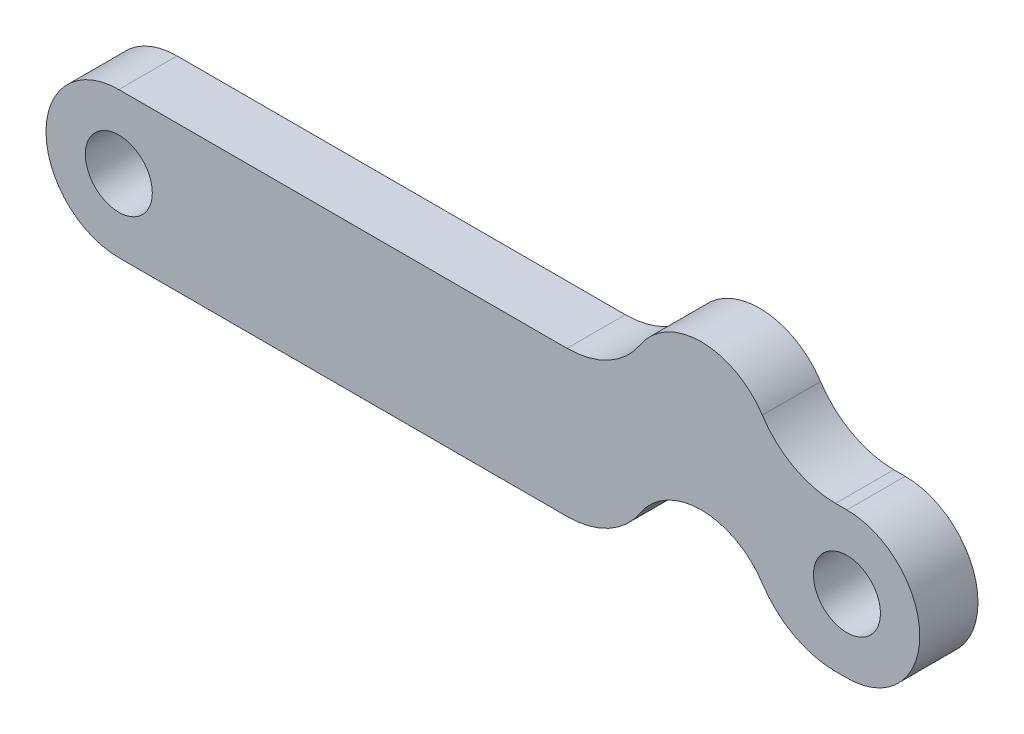
ISO-10303-21;
HEADER;
FILE_DESCRIPTION(('STEP AP214'),'2;1');
FILE_NAME('part.step','',(''),(''),'','','');
FILE_SCHEMA(('AUTOMOTIVE_DESIGN { 1 0 10303 214 1 1 1 1 }'));
ENDSEC;
DATA;
#1=APPLICATION_CONTEXT('core data for automotive mechanical design processes');
#2=APPLICATION_PROTOCOL_DEFINITION('international standard','automotive_design',2000,#1);
#3=PRODUCT_CONTEXT('',#1,'mechanical');
#4=PRODUCT('Part','Part','',(#3));
#5=PRODUCT_RELATED_PRODUCT_CATEGORY('part','',(#4));
#6=PRODUCT_DEFINITION_FORMATION('','',#4);
#7=PRODUCT_DEFINITION_CONTEXT('part definition',#1,'design');
#8=PRODUCT_DEFINITION('design','',#6,#7);
#9=PRODUCT_DEFINITION_SHAPE('','',#8);
#10=(LENGTH_UNIT() NAMED_UNIT(*) SI_UNIT(.MILLI.,.METRE.));
#11=(NAMED_UNIT(*) PLANE_ANGLE_UNIT() SI_UNIT($,.RADIAN.));
#12=(NAMED_UNIT(*) SI_UNIT($,.STERADIAN.) SOLID_ANGLE_UNIT());
#13=UNCERTAINTY_MEASURE_WITH_UNIT(LENGTH_MEASURE(1.E-05),#10,'distance_accuracy_value','');
#14=(GEOMETRIC_REPRESENTATION_CONTEXT(3) GLOBAL_UNCERTAINTY_ASSIGNED_CONTEXT((#13)) GLOBAL_UNIT_ASSIGNED_CONTEXT((#10,
#11,#12)) REPRESENTATION_CONTEXT('',''));
#15=CARTESIAN_POINT('',(0.,0.,0.));
#16=DIRECTION('',(0.,0.,1.));
#17=DIRECTION('',(1.,0.,0.));
#18=AXIS2_PLACEMENT_3D('',#15,#16,#17);
#19=CARTESIAN_POINT('',(24.6097722286465,0.5,2.));
#20=DIRECTION('',(0.,0.,-1.));
#21=DIRECTION('',(-1.,0.,0.));
#22=AXIS2_PLACEMENT_3D('',#19,#20,#21);
#23=CYLINDRICAL_SURFACE('',#22,3.);
#24=CARTESIAN_POINT('',(24.6097722286465,0.5,2.));
#25=DIRECTION('',(0.,0.,1.));
#26=DIRECTION('',(1.,0.,0.));
#27=AXIS2_PLACEMENT_3D('',#24,#25,#26);
#28=CIRCLE('',#27,3.);
#29=CARTESIAN_POINT('',(22.0953510130211,-1.13636363636364,2.));
#30=VERTEX_POINT('',#29);
#31=CARTESIAN_POINT('',(24.6097722286465,-2.5,2.));
#32=VERTEX_POINT('',#31);
#33=EDGE_CURVE('E163',#30,#32,#28,.T.);
#34=ORIENTED_EDGE('',*,*,#33,.F.);
#35=DIRECTION('',(0.,0.,1.));
#36=VECTOR('',#35,1.);
#37=CARTESIAN_POINT('',(22.0953510130211,-1.13636363636364,2.));
#38=LINE('',#37,#36);
#39=CARTESIAN_POINT('',(22.0953510130211,-1.13636363636364,0.));
#40=VERTEX_POINT('',#39);
#41=EDGE_CURVE('E681',#40,#30,#38,.T.);
#42=ORIENTED_EDGE('',*,*,#41,.F.);
#43=CARTESIAN_POINT('',(24.6097722286465,0.5,0.));
#44=DIRECTION('',(0.,0.,-1.));
#45=DIRECTION('',(1.,0.,0.));
#46=AXIS2_PLACEMENT_3D('',#43,#44,#45);
#47=CIRCLE('',#46,3.);
#48=CARTESIAN_POINT('',(24.6097722286465,-2.5,0.));
#49=VERTEX_POINT('',#48);
#50=EDGE_CURVE('E11',#49,#40,#47,.T.);
#51=ORIENTED_EDGE('',*,*,#50,.F.);
#52=DIRECTION('',(0.,0.,-1.));
#53=VECTOR('',#52,1.);
#54=CARTESIAN_POINT('',(24.6097722286465,-2.5,0.));
#55=LINE('',#54,#53);
#56=EDGE_CURVE('E698',#32,#49,#55,.T.);
#57=ORIENTED_EDGE('',*,*,#56,.F.);
#58=EDGE_LOOP('',(#34,#42,#51,#57));
#59=FACE_BOUND('',#58,.T.);
#60=ADVANCED_FACE('F17',(#59),#23,.T.);
#61=CARTESIAN_POINT('',(15.3902277713535,0.5,2.));
#62=DIRECTION('',(0.,0.,-1.));
#63=DIRECTION('',(-1.,0.,0.));
#64=AXIS2_PLACEMENT_3D('',#61,#62,#63);
#65=CYLINDRICAL_SURFACE('',#64,3.);
#66=CARTESIAN_POINT('',(15.3902277713535,0.5,2.));
#67=DIRECTION('',(0.,0.,1.));
#68=DIRECTION('',(1.,0.,0.));
#69=AXIS2_PLACEMENT_3D('',#66,#67,#68);
#70=CIRCLE('',#69,3.);
#71=CARTESIAN_POINT('',(15.3902277713535,-2.5,2.));
#72=VERTEX_POINT('',#71);
#73=CARTESIAN_POINT('',(17.9046489869789,-1.13636363636364,2.));
#74=VERTEX_POINT('',#73);
#75=EDGE_CURVE('E39',#72,#74,#70,.T.);
#76=ORIENTED_EDGE('',*,*,#75,.F.);
#77=DIRECTION('',(0.,0.,1.));
#78=VECTOR('',#77,1.);
#79=CARTESIAN_POINT('',(15.3902277713535,-2.5,2.));
#80=LINE('',#79,#78);
#81=CARTESIAN_POINT('',(15.3902277713535,-2.5,0.));
#82=VERTEX_POINT('',#81);
#83=EDGE_CURVE('E154',#82,#72,#80,.T.);
#84=ORIENTED_EDGE('',*,*,#83,.F.);
#85=CARTESIAN_POINT('',(15.3902277713535,0.5,0.));
#86=DIRECTION('',(0.,0.,-1.));
#87=DIRECTION('',(1.,0.,0.));
#88=AXIS2_PLACEMENT_3D('',#85,#86,#87);
#89=CIRCLE('',#88,3.);
#90=CARTESIAN_POINT('',(17.9046489869789,-1.13636363636364,0.));
#91=VERTEX_POINT('',#90);
#92=EDGE_CURVE('E52',#91,#82,#89,.T.);
#93=ORIENTED_EDGE('',*,*,#92,.F.);
#94=DIRECTION('',(0.,0.,-1.));
#95=VECTOR('',#94,1.);
#96=CARTESIAN_POINT('',(17.9046489869789,-1.13636363636364,2.));
#97=LINE('',#96,#95);
#98=EDGE_CURVE('E665',#74,#91,#97,.T.);
#99=ORIENTED_EDGE('',*,*,#98,.F.);
#100=EDGE_LOOP('',(#76,#84,#93,#99));
#101=FACE_BOUND('',#100,.T.);
#102=ADVANCED_FACE('F444',(#101),#65,.T.);
#103=CARTESIAN_POINT('',(24.6097722286465,5.5,2.));
#104=DIRECTION('',(0.,0.,-1.));
#105=DIRECTION('',(-1.,0.,0.));
#106=AXIS2_PLACEMENT_3D('',#103,#104,#105);
#107=CYLINDRICAL_SURFACE('',#106,3.);
#108=CARTESIAN_POINT('',(24.6097722286465,5.5,2.));
#109=DIRECTION('',(0.,0.,-1.));
#110=DIRECTION('',(1.,0.,0.));
#111=AXIS2_PLACEMENT_3D('',#108,#109,#110);
#112=CIRCLE('',#111,3.);
#113=CARTESIAN_POINT('',(24.6097722286465,2.5,2.));
#114=VERTEX_POINT('',#113);
#115=CARTESIAN_POINT('',(22.0953510130211,3.86363636363636,2.));
#116=VERTEX_POINT('',#115);
#117=EDGE_CURVE('E170',#114,#116,#112,.T.);
#118=ORIENTED_EDGE('',*,*,#117,.F.);
#119=DIRECTION('',(0.,0.,1.));
#120=VECTOR('',#119,1.);
#121=CARTESIAN_POINT('',(24.6097722286465,2.5,2.));
#122=LINE('',#121,#120);
#123=CARTESIAN_POINT('',(24.6097722286465,2.5,0.));
#124=VERTEX_POINT('',#123);
#125=EDGE_CURVE('E249',#124,#114,#122,.T.);
#126=ORIENTED_EDGE('',*,*,#125,.F.);
#127=CARTESIAN_POINT('',(24.6097722286465,5.5,0.));
#128=DIRECTION('',(0.,0.,1.));
#129=DIRECTION('',(1.,0.,0.));
#130=AXIS2_PLACEMENT_3D('',#127,#128,#129);
#131=CIRCLE('',#130,3.);
#132=CARTESIAN_POINT('',(22.0953510130211,3.86363636363636,0.));
#133=VERTEX_POINT('',#132);
#134=EDGE_CURVE('E20',#133,#124,#131,.T.);
#135=ORIENTED_EDGE('',*,*,#134,.F.);
#136=DIRECTION('',(0.,0.,-1.));
#137=VECTOR('',#136,1.);
#138=CARTESIAN_POINT('',(22.0953510130211,3.86363636363636,2.));
#139=LINE('',#138,#137);
#140=EDGE_CURVE('E146',#116,#133,#139,.T.);
#141=ORIENTED_EDGE('',*,*,#140,.F.);
#142=EDGE_LOOP('',(#118,#126,#135,#141));
#143=FACE_BOUND('',#142,.T.);
#144=ADVANCED_FACE('F395',(#143),#107,.F.);
#145=CARTESIAN_POINT('',(15.3902277713535,5.5,2.));
#146=DIRECTION('',(0.,0.,-1.));
#147=DIRECTION('',(-1.,0.,0.));
#148=AXIS2_PLACEMENT_3D('',#145,#146,#147);
#149=CYLINDRICAL_SURFACE('',#148,3.);
#150=CARTESIAN_POINT('',(15.3902277713535,5.5,2.));
#151=DIRECTION('',(0.,0.,-1.));
#152=DIRECTION('',(1.,0.,0.));
#153=AXIS2_PLACEMENT_3D('',#150,#151,#152);
#154=CIRCLE('',#153,3.);
#155=CARTESIAN_POINT('',(17.9046489869789,3.86363636363636,2.));
#156=VERTEX_POINT('',#155);
#157=CARTESIAN_POINT('',(15.3902277713535,2.5,2.));
#158=VERTEX_POINT('',#157);
#159=EDGE_CURVE('E168',#156,#158,#154,.T.);
#160=ORIENTED_EDGE('',*,*,#159,.F.);
#161=DIRECTION('',(0.,0.,1.));
#162=VECTOR('',#161,1.);
#163=CARTESIAN_POINT('',(17.9046489869789,3.86363636363636,2.));
#164=LINE('',#163,#162);
#165=CARTESIAN_POINT('',(17.9046489869789,3.86363636363636,0.));
#166=VERTEX_POINT('',#165);
#167=EDGE_CURVE('E124',#166,#156,#164,.T.);
#168=ORIENTED_EDGE('',*,*,#167,.F.);
#169=CARTESIAN_POINT('',(15.3902277713535,5.5,0.));
#170=DIRECTION('',(0.,0.,1.));
#171=DIRECTION('',(1.,0.,0.));
#172=AXIS2_PLACEMENT_3D('',#169,#170,#171);
#173=CIRCLE('',#172,3.);
#174=CARTESIAN_POINT('',(15.3902277713535,2.5,0.));
#175=VERTEX_POINT('',#174);
#176=EDGE_CURVE('E116',#175,#166,#173,.T.);
#177=ORIENTED_EDGE('',*,*,#176,.F.);
#178=DIRECTION('',(0.,0.,-1.));
#179=VECTOR('',#178,1.);
#180=CARTESIAN_POINT('',(15.3902277713535,2.5,2.));
#181=LINE('',#180,#179);
#182=EDGE_CURVE('E120',#158,#175,#181,.T.);
#183=ORIENTED_EDGE('',*,*,#182,.F.);
#184=EDGE_LOOP('',(#160,#168,#177,#183));
#185=FACE_BOUND('',#184,.T.);
#186=ADVANCED_FACE('F119',(#185),#149,.F.);
#187=CARTESIAN_POINT('',(0.,0.,0.));
#188=DIRECTION('',(0.,0.,1.));
#189=DIRECTION('',(1.,0.,0.));
#190=AXIS2_PLACEMENT_3D('',#187,#188,#189);
#191=PLANE('',#190);
#192=CARTESIAN_POINT('',(0.,0.,0.));
#193=DIRECTION('',(0.,0.,1.));
#194=DIRECTION('',(1.,0.,0.));
#195=AXIS2_PLACEMENT_3D('',#192,#193,#194);
#196=CIRCLE('',#195,1.15);
#197=CARTESIAN_POINT('',(1.15,0.,0.));
#198=VERTEX_POINT('',#197);
#199=EDGE_CURVE('E613',#198,#198,#196,.T.);
#200=ORIENTED_EDGE('',*,*,#199,.T.);
#201=EDGE_LOOP('',(#200));
#202=FACE_BOUND('',#201,.T.);
#203=CARTESIAN_POINT('',(25.,0.,0.));
#204=DIRECTION('',(0.,0.,1.));
#205=DIRECTION('',(1.,0.,0.));
#206=AXIS2_PLACEMENT_3D('',#203,#204,#205);
#207=CIRCLE('',#206,1.15);
#208=CARTESIAN_POINT('',(26.15,0.,0.));
#209=VERTEX_POINT('',#208);
#210=EDGE_CURVE('E598',#209,#209,#207,.T.);
#211=ORIENTED_EDGE('',*,*,#210,.T.);
#212=EDGE_LOOP('',(#211));
#213=FACE_BOUND('',#212,.T.);
#214=CARTESIAN_POINT('',(20.,-2.5,0.));
#215=DIRECTION('',(0.,0.,1.));
#216=DIRECTION('',(1.,0.,0.));
#217=AXIS2_PLACEMENT_3D('',#214,#215,#216);
#218=CIRCLE('',#217,2.5);
#219=EDGE_CURVE('E674',#40,#91,#218,.T.);
#220=ORIENTED_EDGE('',*,*,#219,.T.);
#221=ORIENTED_EDGE('',*,*,#92,.T.);
#222=DIRECTION('',(1.,0.,0.));
#223=VECTOR('',#222,1.);
#224=CARTESIAN_POINT('',(0.,-2.5,0.));
#225=LINE('',#224,#223);
#226=CARTESIAN_POINT('',(0.,-2.5,0.));
#227=VERTEX_POINT('',#226);
#228=EDGE_CURVE('E152',#227,#82,#225,.T.);
#229=ORIENTED_EDGE('',*,*,#228,.F.);
#230=CARTESIAN_POINT('',(0.,0.,0.));
#231=DIRECTION('',(0.,0.,1.));
#232=DIRECTION('',(1.,0.,0.));
#233=AXIS2_PLACEMENT_3D('',#230,#231,#232);
#234=CIRCLE('',#233,2.5);
#235=CARTESIAN_POINT('',(0.,2.5,0.));
#236=VERTEX_POINT('',#235);
#237=EDGE_CURVE('E135',#236,#227,#234,.T.);
#238=ORIENTED_EDGE('',*,*,#237,.F.);
#239=DIRECTION('',(1.,0.,0.));
#240=VECTOR('',#239,1.);
#241=CARTESIAN_POINT('',(0.,2.5,0.));
#242=LINE('',#241,#240);
#243=EDGE_CURVE('E127',#236,#175,#242,.T.);
#244=ORIENTED_EDGE('',*,*,#243,.T.);
#245=ORIENTED_EDGE('',*,*,#176,.T.);
#246=CARTESIAN_POINT('',(20.,2.5,0.));
#247=DIRECTION('',(0.,0.,1.));
#248=DIRECTION('',(1.,0.,0.));
#249=AXIS2_PLACEMENT_3D('',#246,#247,#248);
#250=CIRCLE('',#249,2.5);
#251=EDGE_CURVE('E275',#133,#166,#250,.T.);
#252=ORIENTED_EDGE('',*,*,#251,.F.);
#253=ORIENTED_EDGE('',*,*,#134,.T.);
#254=DIRECTION('',(1.,0.,0.));
#255=VECTOR('',#254,1.);
#256=CARTESIAN_POINT('',(0.,2.5,0.));
#257=LINE('',#256,#255);
#258=CARTESIAN_POINT('',(25.,2.5,0.));
#259=VERTEX_POINT('',#258);
#260=EDGE_CURVE('E239',#124,#259,#257,.T.);
#261=ORIENTED_EDGE('',*,*,#260,.T.);
#262=CARTESIAN_POINT('',(25.,0.,0.));
#263=DIRECTION('',(0.,0.,1.));
#264=DIRECTION('',(1.,0.,0.));
#265=AXIS2_PLACEMENT_3D('',#262,#263,#264);
#266=CIRCLE('',#265,2.5);
#267=CARTESIAN_POINT('',(25.,-2.5,0.));
#268=VERTEX_POINT('',#267);
#269=EDGE_CURVE('E718',#268,#259,#266,.T.);
#270=ORIENTED_EDGE('',*,*,#269,.F.);
#271=DIRECTION('',(1.,0.,0.));
#272=VECTOR('',#271,1.);
#273=CARTESIAN_POINT('',(0.,-2.5,0.));
#274=LINE('',#273,#272);
#275=EDGE_CURVE('E702',#49,#268,#274,.T.);
#276=ORIENTED_EDGE('',*,*,#275,.F.);
#277=ORIENTED_EDGE('',*,*,#50,.T.);
#278=EDGE_LOOP('',(#220,#221,#229,#238,#244,#245,#252,#253,#261,#270,#276,#277));
#279=FACE_BOUND('',#278,.T.);
#280=ADVANCED_FACE('F129',(#202,#213,#279),#191,.F.);
#281=CARTESIAN_POINT('',(0.,0.,2.));
#282=DIRECTION('',(0.,0.,1.));
#283=DIRECTION('',(1.,0.,0.));
#284=AXIS2_PLACEMENT_3D('',#281,#282,#283);
#285=PLANE('',#284);
#286=CARTESIAN_POINT('',(0.,0.,2.));
#287=DIRECTION('',(0.,0.,1.));
#288=DIRECTION('',(1.,0.,0.));
#289=AXIS2_PLACEMENT_3D('',#286,#287,#288);
#290=CIRCLE('',#289,1.15);
#291=CARTESIAN_POINT('',(1.15,0.,2.));
#292=VERTEX_POINT('',#291);
#293=EDGE_CURVE('E621',#292,#292,#290,.T.);
#294=ORIENTED_EDGE('',*,*,#293,.F.);
#295=EDGE_LOOP('',(#294));
#296=FACE_BOUND('',#295,.T.);
#297=CARTESIAN_POINT('',(25.,0.,2.));
#298=DIRECTION('',(0.,0.,1.));
#299=DIRECTION('',(1.,0.,0.));
#300=AXIS2_PLACEMENT_3D('',#297,#298,#299);
#301=CIRCLE('',#300,1.15);
#302=CARTESIAN_POINT('',(26.15,0.,2.));
#303=VERTEX_POINT('',#302);
#304=EDGE_CURVE('E607',#303,#303,#301,.T.);
#305=ORIENTED_EDGE('',*,*,#304,.F.);
#306=EDGE_LOOP('',(#305));
#307=FACE_BOUND('',#306,.T.);
#308=DIRECTION('',(1.,0.,0.));
#309=VECTOR('',#308,1.);
#310=CARTESIAN_POINT('',(0.,-2.5,2.));
#311=LINE('',#310,#309);
#312=CARTESIAN_POINT('',(0.,-2.5,2.));
#313=VERTEX_POINT('',#312);
#314=EDGE_CURVE('E157',#313,#72,#311,.T.);
#315=ORIENTED_EDGE('',*,*,#314,.T.);
#316=ORIENTED_EDGE('',*,*,#75,.T.);
#317=CARTESIAN_POINT('',(20.,-2.5,2.));
#318=DIRECTION('',(0.,0.,1.));
#319=DIRECTION('',(1.,0.,0.));
#320=AXIS2_PLACEMENT_3D('',#317,#318,#319);
#321=CIRCLE('',#320,2.5);
#322=EDGE_CURVE('E649',#30,#74,#321,.T.);
#323=ORIENTED_EDGE('',*,*,#322,.F.);
#324=ORIENTED_EDGE('',*,*,#33,.T.);
#325=DIRECTION('',(1.,0.,0.));
#326=VECTOR('',#325,1.);
#327=CARTESIAN_POINT('',(0.,-2.5,2.));
#328=LINE('',#327,#326);
#329=CARTESIAN_POINT('',(25.,-2.5,2.));
#330=VERTEX_POINT('',#329);
#331=EDGE_CURVE('E686',#32,#330,#328,.T.);
#332=ORIENTED_EDGE('',*,*,#331,.T.);
#333=CARTESIAN_POINT('',(25.,0.,2.));
#334=DIRECTION('',(0.,0.,1.));
#335=DIRECTION('',(1.,0.,0.));
#336=AXIS2_PLACEMENT_3D('',#333,#334,#335);
#337=CIRCLE('',#336,2.5);
#338=CARTESIAN_POINT('',(25.,2.5,2.));
#339=VERTEX_POINT('',#338);
#340=EDGE_CURVE('E233',#330,#339,#337,.T.);
#341=ORIENTED_EDGE('',*,*,#340,.T.);
#342=DIRECTION('',(1.,0.,0.));
#343=VECTOR('',#342,1.);
#344=CARTESIAN_POINT('',(0.,2.5,2.));
#345=LINE('',#344,#343);
#346=EDGE_CURVE('E263',#114,#339,#345,.T.);
#347=ORIENTED_EDGE('',*,*,#346,.F.);
#348=ORIENTED_EDGE('',*,*,#117,.T.);
#349=CARTESIAN_POINT('',(20.,2.5,2.));
#350=DIRECTION('',(0.,0.,1.));
#351=DIRECTION('',(1.,0.,0.));
#352=AXIS2_PLACEMENT_3D('',#349,#350,#351);
#353=CIRCLE('',#352,2.5);
#354=EDGE_CURVE('E279',#116,#156,#353,.T.);
#355=ORIENTED_EDGE('',*,*,#354,.T.);
#356=ORIENTED_EDGE('',*,*,#159,.T.);
#357=DIRECTION('',(1.,0.,0.));
#358=VECTOR('',#357,1.);
#359=CARTESIAN_POINT('',(0.,2.5,2.));
#360=LINE('',#359,#358);
#361=CARTESIAN_POINT('',(0.,2.5,2.));
#362=VERTEX_POINT('',#361);
#363=EDGE_CURVE('E143',#362,#158,#360,.T.);
#364=ORIENTED_EDGE('',*,*,#363,.F.);
#365=CARTESIAN_POINT('',(0.,0.,2.));
#366=DIRECTION('',(0.,0.,1.));
#367=DIRECTION('',(1.,0.,0.));
#368=AXIS2_PLACEMENT_3D('',#365,#366,#367);
#369=CIRCLE('',#368,2.5);
#370=EDGE_CURVE('E589',#362,#313,#369,.T.);
#371=ORIENTED_EDGE('',*,*,#370,.T.);
#372=EDGE_LOOP('',(#315,#316,#323,#324,#332,#341,#347,#348,#355,#356,#364,#371));
#373=FACE_BOUND('',#372,.T.);
#374=ADVANCED_FACE('F335',(#296,#307,#373),#285,.T.);
#375=CARTESIAN_POINT('',(0.,-2.5,2.));
#376=DIRECTION('',(0.,1.,0.));
#377=DIRECTION('',(1.,0.,0.));
#378=AXIS2_PLACEMENT_3D('',#375,#376,#377);
#379=PLANE('',#378);
#380=ORIENTED_EDGE('',*,*,#228,.T.);
#381=ORIENTED_EDGE('',*,*,#83,.T.);
#382=ORIENTED_EDGE('',*,*,#314,.F.);
#383=DIRECTION('',(0.,0.,-1.));
#384=VECTOR('',#383,1.);
#385=CARTESIAN_POINT('',(0.,-2.5,2.));
#386=LINE('',#385,#384);
#387=EDGE_CURVE('E586',#313,#227,#386,.T.);
#388=ORIENTED_EDGE('',*,*,#387,.T.);
#389=EDGE_LOOP('',(#380,#381,#382,#388));
#390=FACE_BOUND('',#389,.T.);
#391=ADVANCED_FACE('F327',(#390),#379,.F.);
#392=CARTESIAN_POINT('',(0.,2.5,2.));
#393=DIRECTION('',(0.,1.,0.));
#394=DIRECTION('',(1.,0.,0.));
#395=AXIS2_PLACEMENT_3D('',#392,#393,#394);
#396=PLANE('',#395);
#397=ORIENTED_EDGE('',*,*,#363,.T.);
#398=ORIENTED_EDGE('',*,*,#182,.T.);
#399=ORIENTED_EDGE('',*,*,#243,.F.);
#400=DIRECTION('',(0.,0.,-1.));
#401=VECTOR('',#400,1.);
#402=CARTESIAN_POINT('',(0.,2.5,2.));
#403=LINE('',#402,#401);
#404=EDGE_CURVE('E140',#362,#236,#403,.T.);
#405=ORIENTED_EDGE('',*,*,#404,.F.);
#406=EDGE_LOOP('',(#397,#398,#399,#405));
#407=FACE_BOUND('',#406,.T.);
#408=ADVANCED_FACE('F136',(#407),#396,.T.);
#409=CARTESIAN_POINT('',(20.,2.5,2.));
#410=DIRECTION('',(0.,0.,-1.));
#411=DIRECTION('',(-1.,0.,0.));
#412=AXIS2_PLACEMENT_3D('',#409,#410,#411);
#413=CYLINDRICAL_SURFACE('',#412,2.5);
#414=ORIENTED_EDGE('',*,*,#251,.T.);
#415=ORIENTED_EDGE('',*,*,#167,.T.);
#416=ORIENTED_EDGE('',*,*,#354,.F.);
#417=ORIENTED_EDGE('',*,*,#140,.T.);
#418=EDGE_LOOP('',(#414,#415,#416,#417));
#419=FACE_BOUND('',#418,.T.);
#420=ADVANCED_FACE('F412',(#419),#413,.T.);
#421=CARTESIAN_POINT('',(0.,2.5,2.));
#422=DIRECTION('',(0.,1.,0.));
#423=DIRECTION('',(1.,0.,0.));
#424=AXIS2_PLACEMENT_3D('',#421,#422,#423);
#425=PLANE('',#424);
#426=ORIENTED_EDGE('',*,*,#260,.F.);
#427=ORIENTED_EDGE('',*,*,#125,.T.);
#428=ORIENTED_EDGE('',*,*,#346,.T.);
#429=DIRECTION('',(0.,0.,-1.));
#430=VECTOR('',#429,1.);
#431=CARTESIAN_POINT('',(25.,2.5,2.));
#432=LINE('',#431,#430);
#433=EDGE_CURVE('E232',#339,#259,#432,.T.);
#434=ORIENTED_EDGE('',*,*,#433,.T.);
#435=EDGE_LOOP('',(#426,#427,#428,#434));
#436=FACE_BOUND('',#435,.T.);
#437=ADVANCED_FACE('F344',(#436),#425,.T.);
#438=CARTESIAN_POINT('',(25.,0.,2.));
#439=DIRECTION('',(0.,0.,-1.));
#440=DIRECTION('',(-1.,0.,0.));
#441=AXIS2_PLACEMENT_3D('',#438,#439,#440);
#442=CYLINDRICAL_SURFACE('',#441,2.5);
#443=ORIENTED_EDGE('',*,*,#269,.T.);
#444=ORIENTED_EDGE('',*,*,#433,.F.);
#445=ORIENTED_EDGE('',*,*,#340,.F.);
#446=DIRECTION('',(0.,0.,-1.));
#447=VECTOR('',#446,1.);
#448=CARTESIAN_POINT('',(25.,-2.5,2.));
#449=LINE('',#448,#447);
#450=EDGE_CURVE('E715',#330,#268,#449,.T.);
#451=ORIENTED_EDGE('',*,*,#450,.T.);
#452=EDGE_LOOP('',(#443,#444,#445,#451));
#453=FACE_BOUND('',#452,.T.);
#454=ADVANCED_FACE('F339',(#453),#442,.T.);
#455=CARTESIAN_POINT('',(0.,-2.5,2.));
#456=DIRECTION('',(0.,1.,0.));
#457=DIRECTION('',(1.,0.,0.));
#458=AXIS2_PLACEMENT_3D('',#455,#456,#457);
#459=PLANE('',#458);
#460=ORIENTED_EDGE('',*,*,#331,.F.);
#461=ORIENTED_EDGE('',*,*,#56,.T.);
#462=ORIENTED_EDGE('',*,*,#275,.T.);
#463=ORIENTED_EDGE('',*,*,#450,.F.);
#464=EDGE_LOOP('',(#460,#461,#462,#463));
#465=FACE_BOUND('',#464,.T.);
#466=ADVANCED_FACE('F345',(#465),#459,.F.);
#467=CARTESIAN_POINT('',(20.,-2.5,2.));
#468=DIRECTION('',(0.,0.,-1.));
#469=DIRECTION('',(-1.,0.,0.));
#470=AXIS2_PLACEMENT_3D('',#467,#468,#469);
#471=CYLINDRICAL_SURFACE('',#470,2.5);
#472=ORIENTED_EDGE('',*,*,#322,.T.);
#473=ORIENTED_EDGE('',*,*,#98,.T.);
#474=ORIENTED_EDGE('',*,*,#219,.F.);
#475=ORIENTED_EDGE('',*,*,#41,.T.);
#476=EDGE_LOOP('',(#472,#473,#474,#475));
#477=FACE_BOUND('',#476,.T.);
#478=ADVANCED_FACE('F378',(#477),#471,.F.);
#479=CARTESIAN_POINT('',(0.,0.,2.));
#480=DIRECTION('',(0.,0.,-1.));
#481=DIRECTION('',(-1.,0.,0.));
#482=AXIS2_PLACEMENT_3D('',#479,#480,#481);
#483=CYLINDRICAL_SURFACE('',#482,2.5);
#484=ORIENTED_EDGE('',*,*,#370,.F.);
#485=ORIENTED_EDGE('',*,*,#404,.T.);
#486=ORIENTED_EDGE('',*,*,#237,.T.);
#487=ORIENTED_EDGE('',*,*,#387,.F.);
#488=EDGE_LOOP('',(#484,#485,#486,#487));
#489=FACE_BOUND('',#488,.T.);
#490=ADVANCED_FACE('F369',(#489),#483,.T.);
#491=CARTESIAN_POINT('',(25.,0.,2.));
#492=DIRECTION('',(0.,0.,-1.));
#493=DIRECTION('',(-1.,0.,0.));
#494=AXIS2_PLACEMENT_3D('',#491,#492,#493);
#495=CYLINDRICAL_SURFACE('',#494,1.15);
#496=ORIENTED_EDGE('',*,*,#210,.F.);
#497=EDGE_LOOP('',(#496));
#498=FACE_BOUND('',#497,.T.);
#499=ORIENTED_EDGE('',*,*,#304,.T.);
#500=EDGE_LOOP('',(#499));
#501=FACE_BOUND('',#500,.T.);
#502=ADVANCED_FACE('F352',(#498,#501),#495,.F.);
#503=CARTESIAN_POINT('',(0.,0.,2.));
#504=DIRECTION('',(0.,0.,-1.));
#505=DIRECTION('',(-1.,0.,0.));
#506=AXIS2_PLACEMENT_3D('',#503,#504,#505);
#507=CYLINDRICAL_SURFACE('',#506,1.15);
#508=ORIENTED_EDGE('',*,*,#199,.F.);
#509=EDGE_LOOP('',(#508));
#510=FACE_BOUND('',#509,.T.);
#511=ORIENTED_EDGE('',*,*,#293,.T.);
#512=EDGE_LOOP('',(#511));
#513=FACE_BOUND('',#512,.T.);
#514=ADVANCED_FACE('F347',(#510,#513),#507,.F.);
#515=CLOSED_SHELL('',(#60,#102,#144,#186,#280,#374,#391,#408,#420,#437,#454,#466,#478,#490,#502,#514));
#516=MANIFOLD_SOLID_BREP('B1',#515);
#517=ADVANCED_BREP_SHAPE_REPRESENTATION('',(#18,#516),#14);
#518=SHAPE_DEFINITION_REPRESENTATION(#9,#517);
ENDSEC;
END-ISO-10303-21;
